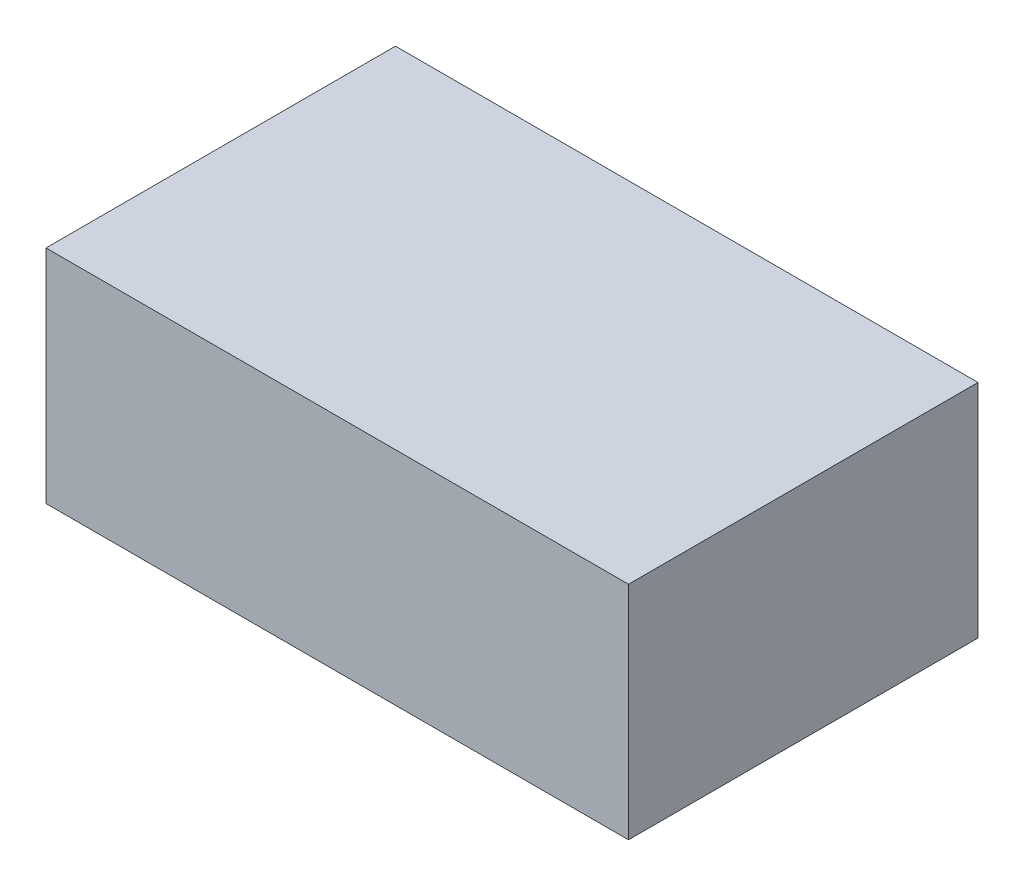
ISO-10303-21;
HEADER;
FILE_DESCRIPTION(('STEP AP214'),'2;1');
FILE_NAME('part.step','',(''),(''),'','','');
FILE_SCHEMA(('AUTOMOTIVE_DESIGN { 1 0 10303 214 1 1 1 1 }'));
ENDSEC;
DATA;
#1=APPLICATION_CONTEXT('core data for automotive mechanical design processes');
#2=APPLICATION_PROTOCOL_DEFINITION('international standard','automotive_design',2000,#1);
#3=PRODUCT_CONTEXT('',#1,'mechanical');
#4=PRODUCT('Part','Part','',(#3));
#5=PRODUCT_RELATED_PRODUCT_CATEGORY('part','',(#4));
#6=PRODUCT_DEFINITION_FORMATION('','',#4);
#7=PRODUCT_DEFINITION_CONTEXT('part definition',#1,'design');
#8=PRODUCT_DEFINITION('design','',#6,#7);
#9=PRODUCT_DEFINITION_SHAPE('','',#8);
#10=(LENGTH_UNIT() NAMED_UNIT(*) SI_UNIT(.MILLI.,.METRE.));
#11=(NAMED_UNIT(*) PLANE_ANGLE_UNIT() SI_UNIT($,.RADIAN.));
#12=(NAMED_UNIT(*) SI_UNIT($,.STERADIAN.) SOLID_ANGLE_UNIT());
#13=UNCERTAINTY_MEASURE_WITH_UNIT(LENGTH_MEASURE(1.E-05),#10,'distance_accuracy_value','');
#14=(GEOMETRIC_REPRESENTATION_CONTEXT(3) GLOBAL_UNCERTAINTY_ASSIGNED_CONTEXT((#13)) GLOBAL_UNIT_ASSIGNED_CONTEXT((#10,
#11,#12)) REPRESENTATION_CONTEXT('',''));
#15=CARTESIAN_POINT('',(0.,0.,0.));
#16=DIRECTION('',(0.,0.,1.));
#17=DIRECTION('',(1.,0.,0.));
#18=AXIS2_PLACEMENT_3D('',#15,#16,#17);
#19=CARTESIAN_POINT('',(25.,19.,15.));
#20=DIRECTION('',(-1.,0.,0.));
#21=DIRECTION('',(0.,0.,1.));
#22=AXIS2_PLACEMENT_3D('',#19,#20,#21);
#23=PLANE('',#22);
#24=DIRECTION('',(0.,0.,-1.));
#25=VECTOR('',#24,1.);
#26=CARTESIAN_POINT('',(25.,0.,15.));
#27=LINE('',#26,#25);
#28=CARTESIAN_POINT('',(25.,0.,15.));
#29=VERTEX_POINT('',#28);
#30=CARTESIAN_POINT('',(25.,0.,-15.));
#31=VERTEX_POINT('',#30);
#32=EDGE_CURVE('E113',#29,#31,#27,.T.);
#33=ORIENTED_EDGE('',*,*,#32,.T.);
#34=DIRECTION('',(0.,-1.,0.));
#35=VECTOR('',#34,1.);
#36=CARTESIAN_POINT('',(25.,19.,-15.));
#37=LINE('',#36,#35);
#38=CARTESIAN_POINT('',(25.,19.,-15.));
#39=VERTEX_POINT('',#38);
#40=EDGE_CURVE('E11',#39,#31,#37,.T.);
#41=ORIENTED_EDGE('',*,*,#40,.F.);
#42=DIRECTION('',(0.,0.,-1.));
#43=VECTOR('',#42,1.);
#44=CARTESIAN_POINT('',(25.,19.,15.));
#45=LINE('',#44,#43);
#46=CARTESIAN_POINT('',(25.,19.,15.));
#47=VERTEX_POINT('',#46);
#48=EDGE_CURVE('E97',#47,#39,#45,.T.);
#49=ORIENTED_EDGE('',*,*,#48,.F.);
#50=DIRECTION('',(0.,-1.,0.));
#51=VECTOR('',#50,1.);
#52=CARTESIAN_POINT('',(25.,19.,15.));
#53=LINE('',#52,#51);
#54=EDGE_CURVE('E112',#47,#29,#53,.T.);
#55=ORIENTED_EDGE('',*,*,#54,.T.);
#56=EDGE_LOOP('',(#33,#41,#49,#55));
#57=FACE_BOUND('',#56,.T.);
#58=ADVANCED_FACE('F50',(#57),#23,.F.);
#59=CARTESIAN_POINT('',(-25.,19.,-15.));
#60=DIRECTION('',(0.,0.,1.));
#61=DIRECTION('',(1.,0.,0.));
#62=AXIS2_PLACEMENT_3D('',#59,#60,#61);
#63=PLANE('',#62);
#64=DIRECTION('',(-1.,0.,0.));
#65=VECTOR('',#64,1.);
#66=CARTESIAN_POINT('',(-25.,0.,-15.));
#67=LINE('',#66,#65);
#68=CARTESIAN_POINT('',(-25.,0.,-15.));
#69=VERTEX_POINT('',#68);
#70=EDGE_CURVE('E102',#31,#69,#67,.T.);
#71=ORIENTED_EDGE('',*,*,#70,.T.);
#72=DIRECTION('',(0.,-1.,0.));
#73=VECTOR('',#72,1.);
#74=CARTESIAN_POINT('',(-25.,19.,-15.));
#75=LINE('',#74,#73);
#76=CARTESIAN_POINT('',(-25.,19.,-15.));
#77=VERTEX_POINT('',#76);
#78=EDGE_CURVE('E57',#77,#69,#75,.T.);
#79=ORIENTED_EDGE('',*,*,#78,.F.);
#80=DIRECTION('',(-1.,0.,0.));
#81=VECTOR('',#80,1.);
#82=CARTESIAN_POINT('',(-25.,19.,-15.));
#83=LINE('',#82,#81);
#84=EDGE_CURVE('E94',#39,#77,#83,.T.);
#85=ORIENTED_EDGE('',*,*,#84,.F.);
#86=ORIENTED_EDGE('',*,*,#40,.T.);
#87=EDGE_LOOP('',(#71,#79,#85,#86));
#88=FACE_BOUND('',#87,.T.);
#89=ADVANCED_FACE('F103',(#88),#63,.F.);
#90=CARTESIAN_POINT('',(-25.,19.,15.));
#91=DIRECTION('',(1.,0.,0.));
#92=DIRECTION('',(0.,0.,-1.));
#93=AXIS2_PLACEMENT_3D('',#90,#91,#92);
#94=PLANE('',#93);
#95=DIRECTION('',(0.,0.,1.));
#96=VECTOR('',#95,1.);
#97=CARTESIAN_POINT('',(-25.,0.,15.));
#98=LINE('',#97,#96);
#99=CARTESIAN_POINT('',(-25.,0.,15.));
#100=VERTEX_POINT('',#99);
#101=EDGE_CURVE('E83',#69,#100,#98,.T.);
#102=ORIENTED_EDGE('',*,*,#101,.T.);
#103=DIRECTION('',(0.,-1.,0.));
#104=VECTOR('',#103,1.);
#105=CARTESIAN_POINT('',(-25.,19.,15.));
#106=LINE('',#105,#104);
#107=CARTESIAN_POINT('',(-25.,19.,15.));
#108=VERTEX_POINT('',#107);
#109=EDGE_CURVE('E106',#108,#100,#106,.T.);
#110=ORIENTED_EDGE('',*,*,#109,.F.);
#111=DIRECTION('',(0.,0.,1.));
#112=VECTOR('',#111,1.);
#113=CARTESIAN_POINT('',(-25.,19.,15.));
#114=LINE('',#113,#112);
#115=EDGE_CURVE('E100',#77,#108,#114,.T.);
#116=ORIENTED_EDGE('',*,*,#115,.F.);
#117=ORIENTED_EDGE('',*,*,#78,.T.);
#118=EDGE_LOOP('',(#102,#110,#116,#117));
#119=FACE_BOUND('',#118,.T.);
#120=ADVANCED_FACE('F110',(#119),#94,.F.);
#121=CARTESIAN_POINT('',(-25.,19.,15.));
#122=DIRECTION('',(0.,0.,-1.));
#123=DIRECTION('',(-1.,0.,0.));
#124=AXIS2_PLACEMENT_3D('',#121,#122,#123);
#125=PLANE('',#124);
#126=DIRECTION('',(1.,0.,0.));
#127=VECTOR('',#126,1.);
#128=CARTESIAN_POINT('',(-25.,0.,15.));
#129=LINE('',#128,#127);
#130=EDGE_CURVE('E87',#100,#29,#129,.T.);
#131=ORIENTED_EDGE('',*,*,#130,.T.);
#132=ORIENTED_EDGE('',*,*,#54,.F.);
#133=DIRECTION('',(1.,0.,0.));
#134=VECTOR('',#133,1.);
#135=CARTESIAN_POINT('',(-25.,19.,15.));
#136=LINE('',#135,#134);
#137=EDGE_CURVE('E63',#108,#47,#136,.T.);
#138=ORIENTED_EDGE('',*,*,#137,.F.);
#139=ORIENTED_EDGE('',*,*,#109,.T.);
#140=EDGE_LOOP('',(#131,#132,#138,#139));
#141=FACE_BOUND('',#140,.T.);
#142=ADVANCED_FACE('F126',(#141),#125,.F.);
#143=CARTESIAN_POINT('',(0.,19.,0.));
#144=DIRECTION('',(0.,-1.,0.));
#145=DIRECTION('',(0.,0.,-1.));
#146=AXIS2_PLACEMENT_3D('',#143,#144,#145);
#147=PLANE('',#146);
#148=ORIENTED_EDGE('',*,*,#48,.T.);
#149=ORIENTED_EDGE('',*,*,#84,.T.);
#150=ORIENTED_EDGE('',*,*,#115,.T.);
#151=ORIENTED_EDGE('',*,*,#137,.T.);
#152=EDGE_LOOP('',(#148,#149,#150,#151));
#153=FACE_BOUND('',#152,.T.);
#154=ADVANCED_FACE('F92',(#153),#147,.F.);
#155=CARTESIAN_POINT('',(0.,0.,0.));
#156=DIRECTION('',(0.,-1.,0.));
#157=DIRECTION('',(0.,0.,-1.));
#158=AXIS2_PLACEMENT_3D('',#155,#156,#157);
#159=PLANE('',#158);
#160=ORIENTED_EDGE('',*,*,#32,.F.);
#161=ORIENTED_EDGE('',*,*,#130,.F.);
#162=ORIENTED_EDGE('',*,*,#101,.F.);
#163=ORIENTED_EDGE('',*,*,#70,.F.);
#164=EDGE_LOOP('',(#160,#161,#162,#163));
#165=FACE_BOUND('',#164,.T.);
#166=ADVANCED_FACE('F131',(#165),#159,.T.);
#167=CLOSED_SHELL('',(#58,#89,#120,#142,#154,#166));
#168=MANIFOLD_SOLID_BREP('B2',#167);
#169=ADVANCED_BREP_SHAPE_REPRESENTATION('',(#18,#168),#14);
#170=SHAPE_DEFINITION_REPRESENTATION(#9,#169);
ENDSEC;
END-ISO-10303-21;
